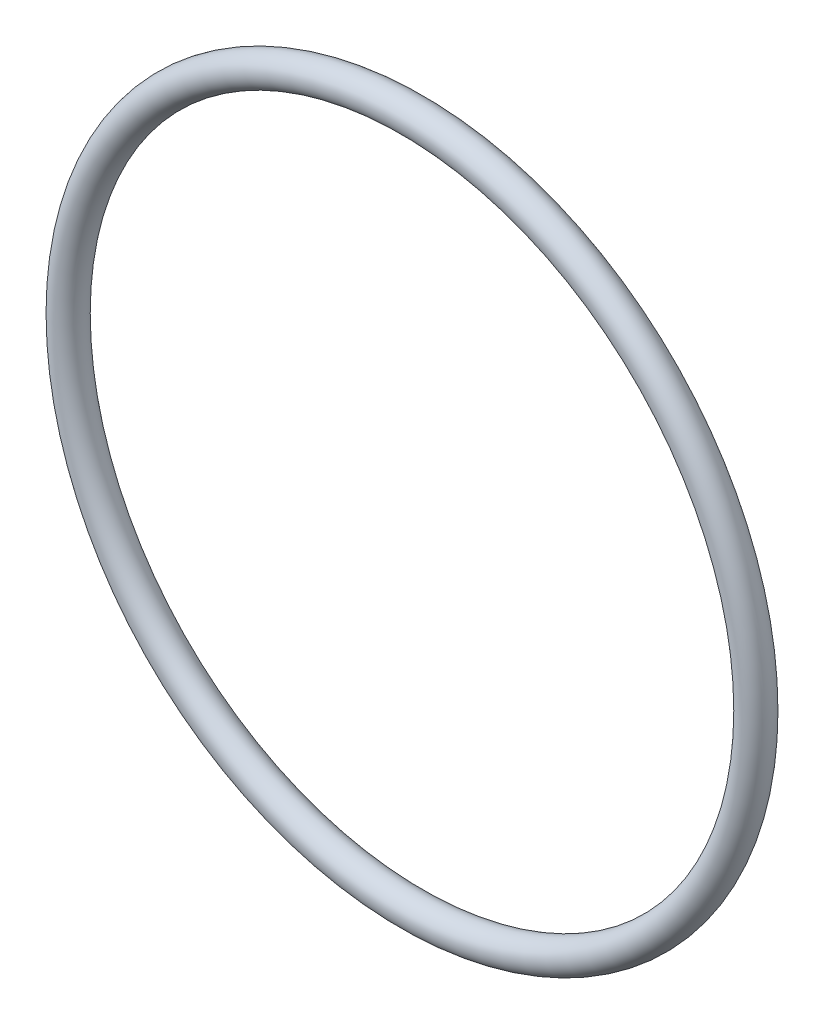
ISO-10303-21;
HEADER;
FILE_DESCRIPTION(('STEP AP214'),'2;1');
FILE_NAME('part.step','',(''),(''),'','','');
FILE_SCHEMA(('AUTOMOTIVE_DESIGN { 1 0 10303 214 1 1 1 1 }'));
ENDSEC;
DATA;
#1=APPLICATION_CONTEXT('core data for automotive mechanical design processes');
#2=APPLICATION_PROTOCOL_DEFINITION('international standard','automotive_design',2000,#1);
#3=PRODUCT_CONTEXT('',#1,'mechanical');
#4=PRODUCT('Part','Part','',(#3));
#5=PRODUCT_RELATED_PRODUCT_CATEGORY('part','',(#4));
#6=PRODUCT_DEFINITION_FORMATION('','',#4);
#7=PRODUCT_DEFINITION_CONTEXT('part definition',#1,'design');
#8=PRODUCT_DEFINITION('design','',#6,#7);
#9=PRODUCT_DEFINITION_SHAPE('','',#8);
#10=(LENGTH_UNIT() NAMED_UNIT(*) SI_UNIT(.MILLI.,.METRE.));
#11=(NAMED_UNIT(*) PLANE_ANGLE_UNIT() SI_UNIT($,.RADIAN.));
#12=(NAMED_UNIT(*) SI_UNIT($,.STERADIAN.) SOLID_ANGLE_UNIT());
#13=UNCERTAINTY_MEASURE_WITH_UNIT(LENGTH_MEASURE(1.E-05),#10,'distance_accuracy_value','');
#14=(GEOMETRIC_REPRESENTATION_CONTEXT(3) GLOBAL_UNCERTAINTY_ASSIGNED_CONTEXT((#13)) GLOBAL_UNIT_ASSIGNED_CONTEXT((#10,
#11,#12)) REPRESENTATION_CONTEXT('',''));
#15=CARTESIAN_POINT('',(0.,0.,0.));
#16=DIRECTION('',(0.,0.,1.));
#17=DIRECTION('',(1.,0.,0.));
#18=AXIS2_PLACEMENT_3D('',#15,#16,#17);
#19=CARTESIAN_POINT('',(0.,0.,0.));
#20=DIRECTION('',(0.,0.,1.));
#21=DIRECTION('',(1.,0.,0.));
#22=AXIS2_PLACEMENT_3D('',#19,#20,#21);
#23=TOROIDAL_SURFACE('',#22,22.,1.);
#24=CARTESIAN_POINT('',(23.,0.,0.));
#25=VERTEX_POINT('',#24);
#26=VERTEX_LOOP('',#25);
#27=FACE_BOUND('',#26,.T.);
#28=ADVANCED_FACE('F37',(#27),#23,.T.);
#29=CLOSED_SHELL('',(#28));
#30=MANIFOLD_SOLID_BREP('B2',#29);
#31=ADVANCED_BREP_SHAPE_REPRESENTATION('',(#18,#30),#14);
#32=SHAPE_DEFINITION_REPRESENTATION(#9,#31);
ENDSEC;
END-ISO-10303-21;
